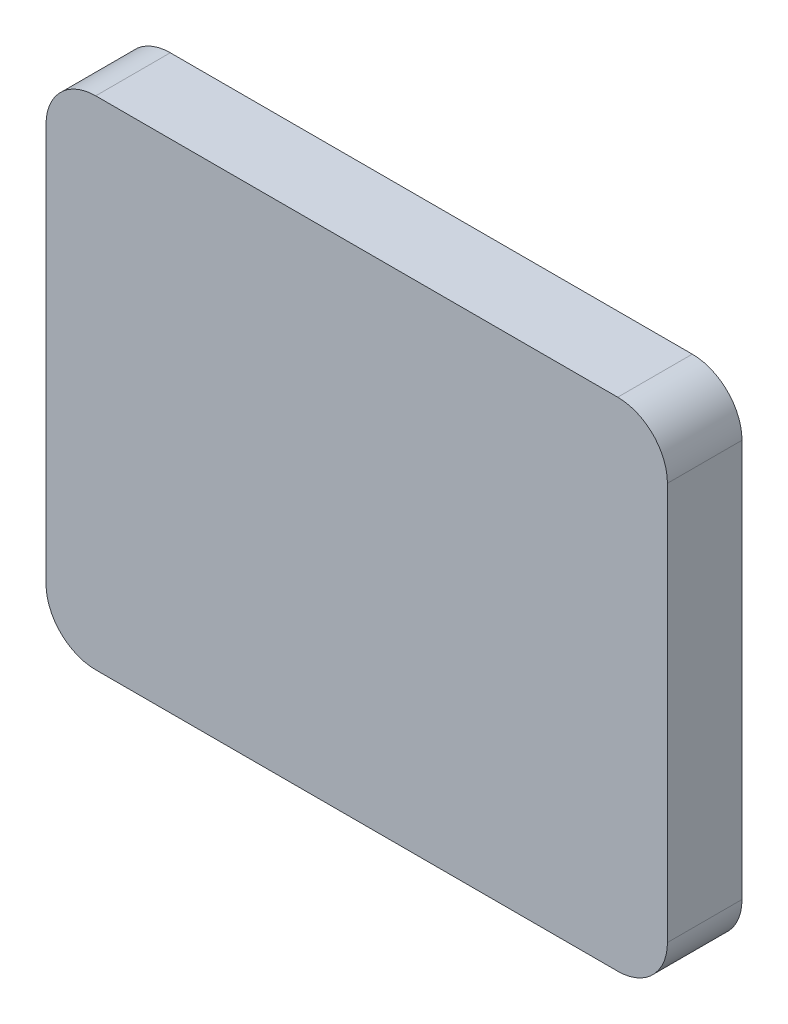
ISO-10303-21;
HEADER;
FILE_DESCRIPTION(('STEP AP214'),'2;1');
FILE_NAME('part.step','',(''),(''),'','','');
FILE_SCHEMA(('AUTOMOTIVE_DESIGN { 1 0 10303 214 1 1 1 1 }'));
ENDSEC;
DATA;
#1=APPLICATION_CONTEXT('core data for automotive mechanical design processes');
#2=APPLICATION_PROTOCOL_DEFINITION('international standard','automotive_design',2000,#1);
#3=PRODUCT_CONTEXT('',#1,'mechanical');
#4=PRODUCT('Part','Part','',(#3));
#5=PRODUCT_RELATED_PRODUCT_CATEGORY('part','',(#4));
#6=PRODUCT_DEFINITION_FORMATION('','',#4);
#7=PRODUCT_DEFINITION_CONTEXT('part definition',#1,'design');
#8=PRODUCT_DEFINITION('design','',#6,#7);
#9=PRODUCT_DEFINITION_SHAPE('','',#8);
#10=(LENGTH_UNIT() NAMED_UNIT(*) SI_UNIT(.MILLI.,.METRE.));
#11=(NAMED_UNIT(*) PLANE_ANGLE_UNIT() SI_UNIT($,.RADIAN.));
#12=(NAMED_UNIT(*) SI_UNIT($,.STERADIAN.) SOLID_ANGLE_UNIT());
#13=UNCERTAINTY_MEASURE_WITH_UNIT(LENGTH_MEASURE(1.E-05),#10,'distance_accuracy_value','');
#14=(GEOMETRIC_REPRESENTATION_CONTEXT(3) GLOBAL_UNCERTAINTY_ASSIGNED_CONTEXT((#13)) GLOBAL_UNIT_ASSIGNED_CONTEXT((#10,
#11,#12)) REPRESENTATION_CONTEXT('',''));
#15=CARTESIAN_POINT('',(0.,0.,0.));
#16=DIRECTION('',(0.,0.,1.));
#17=DIRECTION('',(1.,0.,0.));
#18=AXIS2_PLACEMENT_3D('',#15,#16,#17);
#19=CARTESIAN_POINT('',(-12.5,-10.,3.));
#20=DIRECTION('',(1.,0.,0.));
#21=DIRECTION('',(0.,0.,-1.));
#22=AXIS2_PLACEMENT_3D('',#19,#20,#21);
#23=PLANE('',#22);
#24=DIRECTION('',(0.,-1.,0.));
#25=VECTOR('',#24,1.);
#26=CARTESIAN_POINT('',(-12.5,-10.,3.));
#27=LINE('',#26,#25);
#28=CARTESIAN_POINT('',(-12.5,7.99999999999999,3.));
#29=VERTEX_POINT('',#28);
#30=CARTESIAN_POINT('',(-12.5,-8.,3.));
#31=VERTEX_POINT('',#30);
#32=EDGE_CURVE('E119',#29,#31,#27,.T.);
#33=ORIENTED_EDGE('',*,*,#32,.F.);
#34=DIRECTION('',(0.,0.,-1.));
#35=VECTOR('',#34,1.);
#36=CARTESIAN_POINT('',(-12.5,7.99999999999999,3.));
#37=LINE('',#36,#35);
#38=CARTESIAN_POINT('',(-12.5,7.99999999999999,0.));
#39=VERTEX_POINT('',#38);
#40=EDGE_CURVE('E104',#29,#39,#37,.T.);
#41=ORIENTED_EDGE('',*,*,#40,.T.);
#42=DIRECTION('',(0.,-1.,0.));
#43=VECTOR('',#42,1.);
#44=CARTESIAN_POINT('',(-12.5,-10.,0.));
#45=LINE('',#44,#43);
#46=CARTESIAN_POINT('',(-12.5,-8.,0.));
#47=VERTEX_POINT('',#46);
#48=EDGE_CURVE('E116',#39,#47,#45,.T.);
#49=ORIENTED_EDGE('',*,*,#48,.T.);
#50=DIRECTION('',(0.,0.,-1.));
#51=VECTOR('',#50,1.);
#52=CARTESIAN_POINT('',(-12.5,-8.,3.));
#53=LINE('',#52,#51);
#54=EDGE_CURVE('E121',#47,#31,#53,.F.);
#55=ORIENTED_EDGE('',*,*,#54,.T.);
#56=EDGE_LOOP('',(#33,#41,#49,#55));
#57=FACE_BOUND('',#56,.T.);
#58=ADVANCED_FACE('F34',(#57),#23,.F.);
#59=CARTESIAN_POINT('',(12.5,-10.,3.));
#60=DIRECTION('',(0.,1.,0.));
#61=DIRECTION('',(-1.,0.,0.));
#62=AXIS2_PLACEMENT_3D('',#59,#60,#61);
#63=PLANE('',#62);
#64=DIRECTION('',(1.,0.,0.));
#65=VECTOR('',#64,1.);
#66=CARTESIAN_POINT('',(12.5,-10.,3.));
#67=LINE('',#66,#65);
#68=CARTESIAN_POINT('',(-10.5,-10.,3.));
#69=VERTEX_POINT('',#68);
#70=CARTESIAN_POINT('',(10.5,-10.,3.));
#71=VERTEX_POINT('',#70);
#72=EDGE_CURVE('E161',#69,#71,#67,.T.);
#73=ORIENTED_EDGE('',*,*,#72,.F.);
#74=DIRECTION('',(0.,0.,-1.));
#75=VECTOR('',#74,1.);
#76=CARTESIAN_POINT('',(-10.5,-10.,3.));
#77=LINE('',#76,#75);
#78=CARTESIAN_POINT('',(-10.5,-10.,0.));
#79=VERTEX_POINT('',#78);
#80=EDGE_CURVE('E154',#69,#79,#77,.T.);
#81=ORIENTED_EDGE('',*,*,#80,.T.);
#82=DIRECTION('',(1.,0.,0.));
#83=VECTOR('',#82,1.);
#84=CARTESIAN_POINT('',(12.5,-10.,0.));
#85=LINE('',#84,#83);
#86=CARTESIAN_POINT('',(10.5,-10.,0.));
#87=VERTEX_POINT('',#86);
#88=EDGE_CURVE('E125',#79,#87,#85,.T.);
#89=ORIENTED_EDGE('',*,*,#88,.T.);
#90=DIRECTION('',(0.,0.,-1.));
#91=VECTOR('',#90,1.);
#92=CARTESIAN_POINT('',(10.5,-10.,3.));
#93=LINE('',#92,#91);
#94=EDGE_CURVE('E152',#87,#71,#93,.F.);
#95=ORIENTED_EDGE('',*,*,#94,.T.);
#96=EDGE_LOOP('',(#73,#81,#89,#95));
#97=FACE_BOUND('',#96,.T.);
#98=ADVANCED_FACE('F159',(#97),#63,.F.);
#99=CARTESIAN_POINT('',(12.5,-10.,3.));
#100=DIRECTION('',(-1.,0.,0.));
#101=DIRECTION('',(0.,0.,1.));
#102=AXIS2_PLACEMENT_3D('',#99,#100,#101);
#103=PLANE('',#102);
#104=DIRECTION('',(0.,1.,0.));
#105=VECTOR('',#104,1.);
#106=CARTESIAN_POINT('',(12.5,-10.,3.));
#107=LINE('',#106,#105);
#108=CARTESIAN_POINT('',(12.5,-8.,3.));
#109=VERTEX_POINT('',#108);
#110=CARTESIAN_POINT('',(12.5,8.,3.));
#111=VERTEX_POINT('',#110);
#112=EDGE_CURVE('E169',#109,#111,#107,.T.);
#113=ORIENTED_EDGE('',*,*,#112,.F.);
#114=DIRECTION('',(0.,0.,-1.));
#115=VECTOR('',#114,1.);
#116=CARTESIAN_POINT('',(12.5,-8.,3.));
#117=LINE('',#116,#115);
#118=CARTESIAN_POINT('',(12.5,-8.,0.));
#119=VERTEX_POINT('',#118);
#120=EDGE_CURVE('E11',#109,#119,#117,.T.);
#121=ORIENTED_EDGE('',*,*,#120,.T.);
#122=DIRECTION('',(0.,1.,0.));
#123=VECTOR('',#122,1.);
#124=CARTESIAN_POINT('',(12.5,-10.,0.));
#125=LINE('',#124,#123);
#126=CARTESIAN_POINT('',(12.5,8.,0.));
#127=VERTEX_POINT('',#126);
#128=EDGE_CURVE('E128',#119,#127,#125,.T.);
#129=ORIENTED_EDGE('',*,*,#128,.T.);
#130=DIRECTION('',(0.,0.,-1.));
#131=VECTOR('',#130,1.);
#132=CARTESIAN_POINT('',(12.5,8.,3.));
#133=LINE('',#132,#131);
#134=EDGE_CURVE('E42',#127,#111,#133,.F.);
#135=ORIENTED_EDGE('',*,*,#134,.T.);
#136=EDGE_LOOP('',(#113,#121,#129,#135));
#137=FACE_BOUND('',#136,.T.);
#138=ADVANCED_FACE('F168',(#137),#103,.F.);
#139=CARTESIAN_POINT('',(12.5,10.,3.));
#140=DIRECTION('',(0.,-1.,0.));
#141=DIRECTION('',(1.,0.,0.));
#142=AXIS2_PLACEMENT_3D('',#139,#140,#141);
#143=PLANE('',#142);
#144=DIRECTION('',(-1.,0.,0.));
#145=VECTOR('',#144,1.);
#146=CARTESIAN_POINT('',(12.5,10.,0.));
#147=LINE('',#146,#145);
#148=CARTESIAN_POINT('',(10.5,10.,0.));
#149=VERTEX_POINT('',#148);
#150=CARTESIAN_POINT('',(-10.5,10.,0.));
#151=VERTEX_POINT('',#150);
#152=EDGE_CURVE('E135',#149,#151,#147,.T.);
#153=ORIENTED_EDGE('',*,*,#152,.T.);
#154=DIRECTION('',(0.,0.,-1.));
#155=VECTOR('',#154,1.);
#156=CARTESIAN_POINT('',(-10.5,10.,3.));
#157=LINE('',#156,#155);
#158=CARTESIAN_POINT('',(-10.5,10.,3.));
#159=VERTEX_POINT('',#158);
#160=EDGE_CURVE('E105',#151,#159,#157,.F.);
#161=ORIENTED_EDGE('',*,*,#160,.T.);
#162=DIRECTION('',(-1.,0.,0.));
#163=VECTOR('',#162,1.);
#164=CARTESIAN_POINT('',(12.5,10.,3.));
#165=LINE('',#164,#163);
#166=CARTESIAN_POINT('',(10.5,10.,3.));
#167=VERTEX_POINT('',#166);
#168=EDGE_CURVE('E131',#167,#159,#165,.T.);
#169=ORIENTED_EDGE('',*,*,#168,.F.);
#170=DIRECTION('',(0.,0.,-1.));
#171=VECTOR('',#170,1.);
#172=CARTESIAN_POINT('',(10.5,10.,3.));
#173=LINE('',#172,#171);
#174=EDGE_CURVE('E110',#167,#149,#173,.T.);
#175=ORIENTED_EDGE('',*,*,#174,.T.);
#176=EDGE_LOOP('',(#153,#161,#169,#175));
#177=FACE_BOUND('',#176,.T.);
#178=ADVANCED_FACE('F192',(#177),#143,.F.);
#179=CARTESIAN_POINT('',(0.,0.,3.));
#180=DIRECTION('',(0.,0.,1.));
#181=DIRECTION('',(1.,0.,0.));
#182=AXIS2_PLACEMENT_3D('',#179,#180,#181);
#183=PLANE('',#182);
#184=ORIENTED_EDGE('',*,*,#168,.T.);
#185=CARTESIAN_POINT('',(-10.5,7.99999999999999,3.));
#186=DIRECTION('',(0.,0.,1.));
#187=DIRECTION('',(1.,0.,0.));
#188=AXIS2_PLACEMENT_3D('',#185,#186,#187);
#189=CIRCLE('',#188,2.);
#190=EDGE_CURVE('E150',#159,#29,#189,.T.);
#191=ORIENTED_EDGE('',*,*,#190,.T.);
#192=ORIENTED_EDGE('',*,*,#32,.T.);
#193=CARTESIAN_POINT('',(-10.5,-8.,3.));
#194=DIRECTION('',(0.,0.,1.));
#195=DIRECTION('',(1.,0.,0.));
#196=AXIS2_PLACEMENT_3D('',#193,#194,#195);
#197=CIRCLE('',#196,2.);
#198=EDGE_CURVE('E148',#31,#69,#197,.T.);
#199=ORIENTED_EDGE('',*,*,#198,.T.);
#200=ORIENTED_EDGE('',*,*,#72,.T.);
#201=CARTESIAN_POINT('',(10.5,-8.,3.));
#202=DIRECTION('',(0.,0.,1.));
#203=DIRECTION('',(1.,0.,0.));
#204=AXIS2_PLACEMENT_3D('',#201,#202,#203);
#205=CIRCLE('',#204,2.);
#206=EDGE_CURVE('E55',#71,#109,#205,.T.);
#207=ORIENTED_EDGE('',*,*,#206,.T.);
#208=ORIENTED_EDGE('',*,*,#112,.T.);
#209=CARTESIAN_POINT('',(10.5,8.,3.));
#210=DIRECTION('',(0.,0.,1.));
#211=DIRECTION('',(1.,0.,0.));
#212=AXIS2_PLACEMENT_3D('',#209,#210,#211);
#213=CIRCLE('',#212,2.);
#214=EDGE_CURVE('E145',#111,#167,#213,.T.);
#215=ORIENTED_EDGE('',*,*,#214,.T.);
#216=EDGE_LOOP('',(#184,#191,#192,#199,#200,#207,#208,#215));
#217=FACE_BOUND('',#216,.T.);
#218=ADVANCED_FACE('F174',(#217),#183,.T.);
#219=CARTESIAN_POINT('',(0.,0.,0.));
#220=DIRECTION('',(0.,0.,1.));
#221=DIRECTION('',(1.,0.,0.));
#222=AXIS2_PLACEMENT_3D('',#219,#220,#221);
#223=PLANE('',#222);
#224=ORIENTED_EDGE('',*,*,#48,.F.);
#225=CARTESIAN_POINT('',(-10.5,7.99999999999999,0.));
#226=DIRECTION('',(0.,0.,1.));
#227=DIRECTION('',(1.,0.,0.));
#228=AXIS2_PLACEMENT_3D('',#225,#226,#227);
#229=CIRCLE('',#228,2.);
#230=EDGE_CURVE('E100',#39,#151,#229,.F.);
#231=ORIENTED_EDGE('',*,*,#230,.T.);
#232=ORIENTED_EDGE('',*,*,#152,.F.);
#233=CARTESIAN_POINT('',(10.5,8.,0.));
#234=DIRECTION('',(0.,0.,1.));
#235=DIRECTION('',(1.,0.,0.));
#236=AXIS2_PLACEMENT_3D('',#233,#234,#235);
#237=CIRCLE('',#236,2.);
#238=EDGE_CURVE('E120',#149,#127,#237,.F.);
#239=ORIENTED_EDGE('',*,*,#238,.T.);
#240=ORIENTED_EDGE('',*,*,#128,.F.);
#241=CARTESIAN_POINT('',(10.5,-8.,0.));
#242=DIRECTION('',(0.,0.,1.));
#243=DIRECTION('',(1.,0.,0.));
#244=AXIS2_PLACEMENT_3D('',#241,#242,#243);
#245=CIRCLE('',#244,2.);
#246=EDGE_CURVE('E139',#119,#87,#245,.F.);
#247=ORIENTED_EDGE('',*,*,#246,.T.);
#248=ORIENTED_EDGE('',*,*,#88,.F.);
#249=CARTESIAN_POINT('',(-10.5,-8.,0.));
#250=DIRECTION('',(0.,0.,1.));
#251=DIRECTION('',(1.,0.,0.));
#252=AXIS2_PLACEMENT_3D('',#249,#250,#251);
#253=CIRCLE('',#252,2.);
#254=EDGE_CURVE('E111',#79,#47,#253,.F.);
#255=ORIENTED_EDGE('',*,*,#254,.T.);
#256=EDGE_LOOP('',(#224,#231,#232,#239,#240,#247,#248,#255));
#257=FACE_BOUND('',#256,.T.);
#258=ADVANCED_FACE('F123',(#257),#223,.F.);
#259=CARTESIAN_POINT('',(-10.5,7.99999999999999,3.));
#260=DIRECTION('',(0.,0.,-1.));
#261=DIRECTION('',(-1.,0.,0.));
#262=AXIS2_PLACEMENT_3D('',#259,#260,#261);
#263=CYLINDRICAL_SURFACE('',#262,2.);
#264=ORIENTED_EDGE('',*,*,#190,.F.);
#265=ORIENTED_EDGE('',*,*,#160,.F.);
#266=ORIENTED_EDGE('',*,*,#230,.F.);
#267=ORIENTED_EDGE('',*,*,#40,.F.);
#268=EDGE_LOOP('',(#264,#265,#266,#267));
#269=FACE_BOUND('',#268,.T.);
#270=ADVANCED_FACE('F103',(#269),#263,.T.);
#271=CARTESIAN_POINT('',(-10.5,-8.,3.));
#272=DIRECTION('',(0.,0.,-1.));
#273=DIRECTION('',(-1.,0.,0.));
#274=AXIS2_PLACEMENT_3D('',#271,#272,#273);
#275=CYLINDRICAL_SURFACE('',#274,2.);
#276=ORIENTED_EDGE('',*,*,#198,.F.);
#277=ORIENTED_EDGE('',*,*,#54,.F.);
#278=ORIENTED_EDGE('',*,*,#254,.F.);
#279=ORIENTED_EDGE('',*,*,#80,.F.);
#280=EDGE_LOOP('',(#276,#277,#278,#279));
#281=FACE_BOUND('',#280,.T.);
#282=ADVANCED_FACE('F175',(#281),#275,.T.);
#283=CARTESIAN_POINT('',(10.5,-8.,3.));
#284=DIRECTION('',(0.,0.,-1.));
#285=DIRECTION('',(-1.,0.,0.));
#286=AXIS2_PLACEMENT_3D('',#283,#284,#285);
#287=CYLINDRICAL_SURFACE('',#286,2.);
#288=ORIENTED_EDGE('',*,*,#206,.F.);
#289=ORIENTED_EDGE('',*,*,#94,.F.);
#290=ORIENTED_EDGE('',*,*,#246,.F.);
#291=ORIENTED_EDGE('',*,*,#120,.F.);
#292=EDGE_LOOP('',(#288,#289,#290,#291));
#293=FACE_BOUND('',#292,.T.);
#294=ADVANCED_FACE('F167',(#293),#287,.T.);
#295=CARTESIAN_POINT('',(10.5,8.,3.));
#296=DIRECTION('',(0.,0.,-1.));
#297=DIRECTION('',(-1.,0.,0.));
#298=AXIS2_PLACEMENT_3D('',#295,#296,#297);
#299=CYLINDRICAL_SURFACE('',#298,2.);
#300=ORIENTED_EDGE('',*,*,#214,.F.);
#301=ORIENTED_EDGE('',*,*,#134,.F.);
#302=ORIENTED_EDGE('',*,*,#238,.F.);
#303=ORIENTED_EDGE('',*,*,#174,.F.);
#304=EDGE_LOOP('',(#300,#301,#302,#303));
#305=FACE_BOUND('',#304,.T.);
#306=ADVANCED_FACE('F36',(#305),#299,.T.);
#307=CLOSED_SHELL('',(#58,#98,#138,#178,#218,#258,#270,#282,#294,#306));
#308=MANIFOLD_SOLID_BREP('B2',#307);
#309=ADVANCED_BREP_SHAPE_REPRESENTATION('',(#18,#308),#14);
#310=SHAPE_DEFINITION_REPRESENTATION(#9,#309);
ENDSEC;
END-ISO-10303-21;
